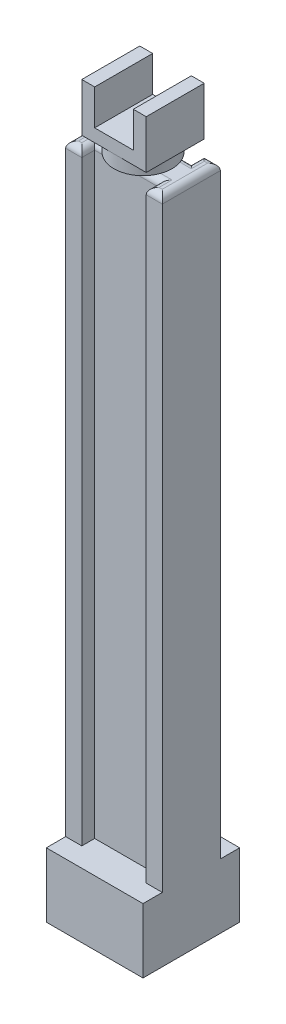
ISO-10303-21;
HEADER;
FILE_DESCRIPTION(('STEP AP214'),'2;1');
FILE_NAME('part.step','',(''),(''),'','','');
FILE_SCHEMA(('AUTOMOTIVE_DESIGN { 1 0 10303 214 1 1 1 1 }'));
ENDSEC;
DATA;
#1=APPLICATION_CONTEXT('core data for automotive mechanical design processes');
#2=APPLICATION_PROTOCOL_DEFINITION('international standard','automotive_design',2000,#1);
#3=PRODUCT_CONTEXT('',#1,'mechanical');
#4=PRODUCT('Part','Part','',(#3));
#5=PRODUCT_RELATED_PRODUCT_CATEGORY('part','',(#4));
#6=PRODUCT_DEFINITION_FORMATION('','',#4);
#7=PRODUCT_DEFINITION_CONTEXT('part definition',#1,'design');
#8=PRODUCT_DEFINITION('design','',#6,#7);
#9=PRODUCT_DEFINITION_SHAPE('','',#8);
#10=(LENGTH_UNIT() NAMED_UNIT(*) SI_UNIT(.MILLI.,.METRE.));
#11=(NAMED_UNIT(*) PLANE_ANGLE_UNIT() SI_UNIT($,.RADIAN.));
#12=(NAMED_UNIT(*) SI_UNIT($,.STERADIAN.) SOLID_ANGLE_UNIT());
#13=UNCERTAINTY_MEASURE_WITH_UNIT(LENGTH_MEASURE(1.E-05),#10,'distance_accuracy_value','');
#14=(GEOMETRIC_REPRESENTATION_CONTEXT(3) GLOBAL_UNCERTAINTY_ASSIGNED_CONTEXT((#13)) GLOBAL_UNIT_ASSIGNED_CONTEXT((#10,
#11,#12)) REPRESENTATION_CONTEXT('',''));
#15=CARTESIAN_POINT('',(0.,0.,0.));
#16=DIRECTION('',(0.,0.,1.));
#17=DIRECTION('',(1.,0.,0.));
#18=AXIS2_PLACEMENT_3D('',#15,#16,#17);
#19=CARTESIAN_POINT('',(-50.,1130.,45.));
#20=DIRECTION('',(0.,-1.,0.));
#21=DIRECTION('',(0.,0.,-1.));
#22=AXIS2_PLACEMENT_3D('',#19,#20,#21);
#23=PLANE('',#22);
#24=DIRECTION('',(-1.,0.,0.));
#25=VECTOR('',#24,1.);
#26=CARTESIAN_POINT('',(-50.,1130.,-45.));
#27=LINE('',#26,#25);
#28=CARTESIAN_POINT('',(50.,1130.,-45.));
#29=VERTEX_POINT('',#28);
#30=CARTESIAN_POINT('',(29.9999999999999,1130.,-45.));
#31=VERTEX_POINT('',#30);
#32=EDGE_CURVE('E295',#29,#31,#27,.T.);
#33=ORIENTED_EDGE('',*,*,#32,.T.);
#34=DIRECTION('',(0.,0.,1.));
#35=VECTOR('',#34,1.);
#36=CARTESIAN_POINT('',(29.9999999999999,1130.,45.));
#37=LINE('',#36,#35);
#38=CARTESIAN_POINT('',(29.9999999999999,1130.,45.));
#39=VERTEX_POINT('',#38);
#40=EDGE_CURVE('E274',#31,#39,#37,.T.);
#41=ORIENTED_EDGE('',*,*,#40,.T.);
#42=DIRECTION('',(-1.,0.,0.));
#43=VECTOR('',#42,1.);
#44=CARTESIAN_POINT('',(-50.,1130.,45.));
#45=LINE('',#44,#43);
#46=CARTESIAN_POINT('',(50.,1130.,45.));
#47=VERTEX_POINT('',#46);
#48=EDGE_CURVE('E283',#47,#39,#45,.T.);
#49=ORIENTED_EDGE('',*,*,#48,.F.);
#50=DIRECTION('',(0.,0.,-1.));
#51=VECTOR('',#50,1.);
#52=CARTESIAN_POINT('',(50.,1130.,45.));
#53=LINE('',#52,#51);
#54=EDGE_CURVE('E311',#47,#29,#53,.T.);
#55=ORIENTED_EDGE('',*,*,#54,.T.);
#56=EDGE_LOOP('',(#33,#41,#49,#55));
#57=FACE_BOUND('',#56,.T.);
#58=ADVANCED_FACE('F33',(#57),#23,.F.);
#59=CARTESIAN_POINT('',(75.,1035.,75.));
#60=DIRECTION('',(0.,1.,0.));
#61=DIRECTION('',(0.,0.,1.));
#62=AXIS2_PLACEMENT_3D('',#59,#60,#61);
#63=PLANE('',#62);
#64=DIRECTION('',(-1.,0.,0.));
#65=VECTOR('',#64,1.);
#66=CARTESIAN_POINT('',(50.,1035.,15.));
#67=LINE('',#66,#65);
#68=CARTESIAN_POINT('',(-60.,1035.,15.));
#69=VERTEX_POINT('',#68);
#70=CARTESIAN_POINT('',(-42.4264068711928,1035.,15.));
#71=VERTEX_POINT('',#70);
#72=EDGE_CURVE('E445',#69,#71,#67,.F.);
#73=ORIENTED_EDGE('',*,*,#72,.T.);
#74=CARTESIAN_POINT('',(0.,1035.,0.));
#75=DIRECTION('',(0.,1.,0.));
#76=DIRECTION('',(0.,0.,1.));
#77=AXIS2_PLACEMENT_3D('',#74,#75,#76);
#78=CIRCLE('',#77,45.);
#79=CARTESIAN_POINT('',(-42.4264068711929,1035.,-15.));
#80=VERTEX_POINT('',#79);
#81=EDGE_CURVE('E519',#80,#71,#78,.T.);
#82=ORIENTED_EDGE('',*,*,#81,.F.);
#83=DIRECTION('',(1.,0.,0.));
#84=VECTOR('',#83,1.);
#85=CARTESIAN_POINT('',(-50.,1035.,-15.));
#86=LINE('',#85,#84);
#87=CARTESIAN_POINT('',(-60.,1035.,-15.));
#88=VERTEX_POINT('',#87);
#89=EDGE_CURVE('E430',#80,#88,#86,.F.);
#90=ORIENTED_EDGE('',*,*,#89,.T.);
#91=DIRECTION('',(0.,0.,1.));
#92=VECTOR('',#91,1.);
#93=CARTESIAN_POINT('',(-60.,1035.,-45.));
#94=LINE('',#93,#92);
#95=CARTESIAN_POINT('',(-60.,1035.,-35.));
#96=VERTEX_POINT('',#95);
#97=EDGE_CURVE('E434',#88,#96,#94,.F.);
#98=ORIENTED_EDGE('',*,*,#97,.T.);
#99=DIRECTION('',(1.,0.,0.));
#100=VECTOR('',#99,1.);
#101=CARTESIAN_POINT('',(-75.,1035.,-35.));
#102=LINE('',#101,#100);
#103=CARTESIAN_POINT('',(-65.,1035.,-35.));
#104=VERTEX_POINT('',#103);
#105=EDGE_CURVE('E436',#96,#104,#102,.F.);
#106=ORIENTED_EDGE('',*,*,#105,.T.);
#107=DIRECTION('',(0.,0.,1.));
#108=VECTOR('',#107,1.);
#109=CARTESIAN_POINT('',(-65.,1035.,45.));
#110=LINE('',#109,#108);
#111=CARTESIAN_POINT('',(-65.,1035.,35.));
#112=VERTEX_POINT('',#111);
#113=EDGE_CURVE('E438',#104,#112,#110,.T.);
#114=ORIENTED_EDGE('',*,*,#113,.T.);
#115=DIRECTION('',(-1.,0.,0.));
#116=VECTOR('',#115,1.);
#117=CARTESIAN_POINT('',(-50.,1035.,35.));
#118=LINE('',#117,#116);
#119=CARTESIAN_POINT('',(-60.,1035.,35.));
#120=VERTEX_POINT('',#119);
#121=EDGE_CURVE('E440',#112,#120,#118,.F.);
#122=ORIENTED_EDGE('',*,*,#121,.T.);
#123=DIRECTION('',(0.,0.,1.));
#124=VECTOR('',#123,1.);
#125=CARTESIAN_POINT('',(-60.,1035.,25.));
#126=LINE('',#125,#124);
#127=EDGE_CURVE('E442',#120,#69,#126,.F.);
#128=ORIENTED_EDGE('',*,*,#127,.T.);
#129=EDGE_LOOP('',(#73,#82,#90,#98,#106,#114,#122,#128));
#130=FACE_BOUND('',#129,.T.);
#131=ADVANCED_FACE('F516',(#130),#63,.T.);
#132=CARTESIAN_POINT('',(60.,1035.,-15.));
#133=VERTEX_POINT('',#132);
#134=CARTESIAN_POINT('',(42.4264068711929,1035.,-15.));
#135=VERTEX_POINT('',#134);
#136=EDGE_CURVE('E431',#133,#135,#86,.F.);
#137=ORIENTED_EDGE('',*,*,#136,.T.);
#138=CARTESIAN_POINT('',(42.4264068711929,1035.,15.));
#139=VERTEX_POINT('',#138);
#140=EDGE_CURVE('E318',#139,#135,#78,.T.);
#141=ORIENTED_EDGE('',*,*,#140,.F.);
#142=CARTESIAN_POINT('',(60.,1035.,15.));
#143=VERTEX_POINT('',#142);
#144=EDGE_CURVE('E444',#139,#143,#67,.F.);
#145=ORIENTED_EDGE('',*,*,#144,.T.);
#146=DIRECTION('',(0.,0.,-1.));
#147=VECTOR('',#146,1.);
#148=CARTESIAN_POINT('',(60.,1035.,45.));
#149=LINE('',#148,#147);
#150=CARTESIAN_POINT('',(60.,1035.,35.));
#151=VERTEX_POINT('',#150);
#152=EDGE_CURVE('E448',#143,#151,#149,.F.);
#153=ORIENTED_EDGE('',*,*,#152,.T.);
#154=DIRECTION('',(-1.,0.,0.));
#155=VECTOR('',#154,1.);
#156=CARTESIAN_POINT('',(75.,1035.,35.));
#157=LINE('',#156,#155);
#158=CARTESIAN_POINT('',(65.,1035.,35.));
#159=VERTEX_POINT('',#158);
#160=EDGE_CURVE('E422',#151,#159,#157,.F.);
#161=ORIENTED_EDGE('',*,*,#160,.T.);
#162=DIRECTION('',(0.,0.,-1.));
#163=VECTOR('',#162,1.);
#164=CARTESIAN_POINT('',(65.,1035.,-45.));
#165=LINE('',#164,#163);
#166=CARTESIAN_POINT('',(65.,1035.,-35.));
#167=VERTEX_POINT('',#166);
#168=EDGE_CURVE('E424',#159,#167,#165,.T.);
#169=ORIENTED_EDGE('',*,*,#168,.T.);
#170=DIRECTION('',(1.,0.,0.));
#171=VECTOR('',#170,1.);
#172=CARTESIAN_POINT('',(50.,1035.,-35.));
#173=LINE('',#172,#171);
#174=CARTESIAN_POINT('',(60.,1035.,-35.));
#175=VERTEX_POINT('',#174);
#176=EDGE_CURVE('E426',#167,#175,#173,.F.);
#177=ORIENTED_EDGE('',*,*,#176,.T.);
#178=DIRECTION('',(0.,0.,-1.));
#179=VECTOR('',#178,1.);
#180=CARTESIAN_POINT('',(60.,1035.,-25.));
#181=LINE('',#180,#179);
#182=EDGE_CURVE('E428',#175,#133,#181,.F.);
#183=ORIENTED_EDGE('',*,*,#182,.T.);
#184=EDGE_LOOP('',(#137,#141,#145,#153,#161,#169,#177,#183));
#185=FACE_BOUND('',#184,.T.);
#186=ADVANCED_FACE('F533',(#185),#63,.T.);
#187=CARTESIAN_POINT('',(75.,1035.,-75.));
#188=DIRECTION('',(-1.,0.,0.));
#189=DIRECTION('',(0.,0.,1.));
#190=AXIS2_PLACEMENT_3D('',#187,#188,#189);
#191=PLANE('',#190);
#192=DIRECTION('',(0.,1.,0.));
#193=VECTOR('',#192,1.);
#194=CARTESIAN_POINT('',(75.,-52.9705854077835,-45.));
#195=LINE('',#194,#193);
#196=CARTESIAN_POINT('',(75.,99.9999999999999,-45.));
#197=VERTEX_POINT('',#196);
#198=CARTESIAN_POINT('',(75.,1025.,-45.));
#199=VERTEX_POINT('',#198);
#200=EDGE_CURVE('E351',#197,#199,#195,.T.);
#201=ORIENTED_EDGE('',*,*,#200,.T.);
#202=DIRECTION('',(0.,0.,-1.));
#203=VECTOR('',#202,1.);
#204=CARTESIAN_POINT('',(75.,1025.,45.));
#205=LINE('',#204,#203);
#206=CARTESIAN_POINT('',(75.,1025.,45.));
#207=VERTEX_POINT('',#206);
#208=EDGE_CURVE('E470',#199,#207,#205,.F.);
#209=ORIENTED_EDGE('',*,*,#208,.T.);
#210=DIRECTION('',(0.,1.,0.));
#211=VECTOR('',#210,1.);
#212=CARTESIAN_POINT('',(75.,-52.9705854077835,45.));
#213=LINE('',#212,#211);
#214=CARTESIAN_POINT('',(75.,99.9999999999999,45.));
#215=VERTEX_POINT('',#214);
#216=EDGE_CURVE('E336',#215,#207,#213,.T.);
#217=ORIENTED_EDGE('',*,*,#216,.F.);
#218=DIRECTION('',(0.,0.,-1.));
#219=VECTOR('',#218,1.);
#220=CARTESIAN_POINT('',(75.,99.9999999999999,45.));
#221=LINE('',#220,#219);
#222=CARTESIAN_POINT('',(75.,99.9999999999999,75.));
#223=VERTEX_POINT('',#222);
#224=EDGE_CURVE('E333',#223,#215,#221,.T.);
#225=ORIENTED_EDGE('',*,*,#224,.F.);
#226=DIRECTION('',(0.,-1.,0.));
#227=VECTOR('',#226,1.);
#228=CARTESIAN_POINT('',(75.,1035.,75.));
#229=LINE('',#228,#227);
#230=CARTESIAN_POINT('',(75.,0.,75.));
#231=VERTEX_POINT('',#230);
#232=EDGE_CURVE('E411',#223,#231,#229,.T.);
#233=ORIENTED_EDGE('',*,*,#232,.T.);
#234=DIRECTION('',(0.,0.,-1.));
#235=VECTOR('',#234,1.);
#236=CARTESIAN_POINT('',(75.,0.,-75.));
#237=LINE('',#236,#235);
#238=CARTESIAN_POINT('',(75.,0.,-75.));
#239=VERTEX_POINT('',#238);
#240=EDGE_CURVE('E397',#231,#239,#237,.T.);
#241=ORIENTED_EDGE('',*,*,#240,.T.);
#242=DIRECTION('',(0.,-1.,0.));
#243=VECTOR('',#242,1.);
#244=CARTESIAN_POINT('',(75.,1035.,-75.));
#245=LINE('',#244,#243);
#246=CARTESIAN_POINT('',(75.,99.9999999999999,-75.));
#247=VERTEX_POINT('',#246);
#248=EDGE_CURVE('E417',#247,#239,#245,.T.);
#249=ORIENTED_EDGE('',*,*,#248,.F.);
#250=DIRECTION('',(0.,0.,-1.));
#251=VECTOR('',#250,1.);
#252=CARTESIAN_POINT('',(75.,99.9999999999999,-45.));
#253=LINE('',#252,#251);
#254=EDGE_CURVE('E347',#197,#247,#253,.T.);
#255=ORIENTED_EDGE('',*,*,#254,.F.);
#256=EDGE_LOOP('',(#201,#209,#217,#225,#233,#241,#249,#255));
#257=FACE_BOUND('',#256,.T.);
#258=ADVANCED_FACE('F733',(#257),#191,.F.);
#259=CARTESIAN_POINT('',(-75.,1035.,-75.));
#260=DIRECTION('',(0.,0.,1.));
#261=DIRECTION('',(1.,0.,0.));
#262=AXIS2_PLACEMENT_3D('',#259,#260,#261);
#263=PLANE('',#262);
#264=DIRECTION('',(0.,-1.,0.));
#265=VECTOR('',#264,1.);
#266=CARTESIAN_POINT('',(-75.,1035.,-75.));
#267=LINE('',#266,#265);
#268=CARTESIAN_POINT('',(-75.,99.9999999999999,-75.));
#269=VERTEX_POINT('',#268);
#270=CARTESIAN_POINT('',(-75.,0.,-75.));
#271=VERTEX_POINT('',#270);
#272=EDGE_CURVE('E415',#269,#271,#267,.T.);
#273=ORIENTED_EDGE('',*,*,#272,.F.);
#274=DIRECTION('',(-1.,0.,0.));
#275=VECTOR('',#274,1.);
#276=CARTESIAN_POINT('',(50.,99.9999999999999,-75.));
#277=LINE('',#276,#275);
#278=EDGE_CURVE('E391',#247,#269,#277,.T.);
#279=ORIENTED_EDGE('',*,*,#278,.F.);
#280=ORIENTED_EDGE('',*,*,#248,.T.);
#281=DIRECTION('',(-1.,0.,0.));
#282=VECTOR('',#281,1.);
#283=CARTESIAN_POINT('',(-75.,0.,-75.));
#284=LINE('',#283,#282);
#285=EDGE_CURVE('E402',#239,#271,#284,.T.);
#286=ORIENTED_EDGE('',*,*,#285,.T.);
#287=EDGE_LOOP('',(#273,#279,#280,#286));
#288=FACE_BOUND('',#287,.T.);
#289=ADVANCED_FACE('F900',(#288),#263,.F.);
#290=CARTESIAN_POINT('',(-75.,1035.,-75.));
#291=DIRECTION('',(1.,0.,0.));
#292=DIRECTION('',(0.,0.,-1.));
#293=AXIS2_PLACEMENT_3D('',#290,#291,#292);
#294=PLANE('',#293);
#295=DIRECTION('',(0.,1.,0.));
#296=VECTOR('',#295,1.);
#297=CARTESIAN_POINT('',(-75.,-52.9705854077835,45.));
#298=LINE('',#297,#296);
#299=CARTESIAN_POINT('',(-75.,99.9999999999999,45.));
#300=VERTEX_POINT('',#299);
#301=CARTESIAN_POINT('',(-75.,1025.,45.));
#302=VERTEX_POINT('',#301);
#303=EDGE_CURVE('E328',#300,#302,#298,.T.);
#304=ORIENTED_EDGE('',*,*,#303,.T.);
#305=DIRECTION('',(0.,0.,1.));
#306=VECTOR('',#305,1.);
#307=CARTESIAN_POINT('',(-75.,1025.,-45.));
#308=LINE('',#307,#306);
#309=CARTESIAN_POINT('',(-75.,1025.,-45.));
#310=VERTEX_POINT('',#309);
#311=EDGE_CURVE('E458',#302,#310,#308,.F.);
#312=ORIENTED_EDGE('',*,*,#311,.T.);
#313=DIRECTION('',(0.,1.,0.));
#314=VECTOR('',#313,1.);
#315=CARTESIAN_POINT('',(-75.,-52.9705854077835,-45.));
#316=LINE('',#315,#314);
#317=CARTESIAN_POINT('',(-75.,99.9999999999999,-45.));
#318=VERTEX_POINT('',#317);
#319=EDGE_CURVE('E358',#318,#310,#316,.T.);
#320=ORIENTED_EDGE('',*,*,#319,.F.);
#321=DIRECTION('',(0.,0.,1.));
#322=VECTOR('',#321,1.);
#323=CARTESIAN_POINT('',(-75.,99.9999999999999,-45.));
#324=LINE('',#323,#322);
#325=EDGE_CURVE('E346',#269,#318,#324,.T.);
#326=ORIENTED_EDGE('',*,*,#325,.F.);
#327=ORIENTED_EDGE('',*,*,#272,.T.);
#328=DIRECTION('',(0.,0.,1.));
#329=VECTOR('',#328,1.);
#330=CARTESIAN_POINT('',(-75.,0.,-75.));
#331=LINE('',#330,#329);
#332=CARTESIAN_POINT('',(-75.,0.,75.));
#333=VERTEX_POINT('',#332);
#334=EDGE_CURVE('E405',#271,#333,#331,.T.);
#335=ORIENTED_EDGE('',*,*,#334,.T.);
#336=DIRECTION('',(0.,-1.,0.));
#337=VECTOR('',#336,1.);
#338=CARTESIAN_POINT('',(-75.,1035.,75.));
#339=LINE('',#338,#337);
#340=CARTESIAN_POINT('',(-75.,99.9999999999999,75.));
#341=VERTEX_POINT('',#340);
#342=EDGE_CURVE('E413',#341,#333,#339,.T.);
#343=ORIENTED_EDGE('',*,*,#342,.F.);
#344=DIRECTION('',(0.,0.,1.));
#345=VECTOR('',#344,1.);
#346=CARTESIAN_POINT('',(-75.,99.9999999999999,45.));
#347=LINE('',#346,#345);
#348=EDGE_CURVE('E324',#300,#341,#347,.T.);
#349=ORIENTED_EDGE('',*,*,#348,.F.);
#350=EDGE_LOOP('',(#304,#312,#320,#326,#327,#335,#343,#349));
#351=FACE_BOUND('',#350,.T.);
#352=ADVANCED_FACE('F890',(#351),#294,.F.);
#353=CARTESIAN_POINT('',(-75.,1035.,75.));
#354=DIRECTION('',(0.,0.,-1.));
#355=DIRECTION('',(-1.,0.,0.));
#356=AXIS2_PLACEMENT_3D('',#353,#354,#355);
#357=PLANE('',#356);
#358=ORIENTED_EDGE('',*,*,#232,.F.);
#359=DIRECTION('',(1.,0.,0.));
#360=VECTOR('',#359,1.);
#361=CARTESIAN_POINT('',(50.,99.9999999999999,75.));
#362=LINE('',#361,#360);
#363=EDGE_CURVE('E375',#341,#223,#362,.T.);
#364=ORIENTED_EDGE('',*,*,#363,.F.);
#365=ORIENTED_EDGE('',*,*,#342,.T.);
#366=DIRECTION('',(1.,0.,0.));
#367=VECTOR('',#366,1.);
#368=CARTESIAN_POINT('',(-75.,0.,75.));
#369=LINE('',#368,#367);
#370=EDGE_CURVE('E408',#333,#231,#369,.T.);
#371=ORIENTED_EDGE('',*,*,#370,.T.);
#372=EDGE_LOOP('',(#358,#364,#365,#371));
#373=FACE_BOUND('',#372,.T.);
#374=ADVANCED_FACE('F884',(#373),#357,.F.);
#375=CARTESIAN_POINT('',(75.,0.,75.));
#376=DIRECTION('',(0.,1.,0.));
#377=DIRECTION('',(0.,0.,1.));
#378=AXIS2_PLACEMENT_3D('',#375,#376,#377);
#379=PLANE('',#378);
#380=ORIENTED_EDGE('',*,*,#240,.F.);
#381=ORIENTED_EDGE('',*,*,#370,.F.);
#382=ORIENTED_EDGE('',*,*,#334,.F.);
#383=ORIENTED_EDGE('',*,*,#285,.F.);
#384=EDGE_LOOP('',(#380,#381,#382,#383));
#385=FACE_BOUND('',#384,.T.);
#386=ADVANCED_FACE('F889',(#385),#379,.F.);
#387=CARTESIAN_POINT('',(-50.,99.9999999999999,-25.));
#388=DIRECTION('',(-1.,0.,0.));
#389=DIRECTION('',(0.,0.,1.));
#390=AXIS2_PLACEMENT_3D('',#387,#388,#389);
#391=PLANE('',#390);
#392=DIRECTION('',(0.,1.,0.));
#393=VECTOR('',#392,1.);
#394=CARTESIAN_POINT('',(-50.,99.9999999999999,-45.));
#395=LINE('',#394,#393);
#396=CARTESIAN_POINT('',(-50.,99.9999999999999,-45.));
#397=VERTEX_POINT('',#396);
#398=CARTESIAN_POINT('',(-50.,1025.,-45.));
#399=VERTEX_POINT('',#398);
#400=EDGE_CURVE('E364',#397,#399,#395,.T.);
#401=ORIENTED_EDGE('',*,*,#400,.T.);
#402=DIRECTION('',(0.,0.,1.));
#403=VECTOR('',#402,1.);
#404=CARTESIAN_POINT('',(-50.,1025.,-25.));
#405=LINE('',#404,#403);
#406=CARTESIAN_POINT('',(-50.,1025.,-25.));
#407=VERTEX_POINT('',#406);
#408=EDGE_CURVE('E462',#399,#407,#405,.T.);
#409=ORIENTED_EDGE('',*,*,#408,.T.);
#410=DIRECTION('',(0.,1.,0.));
#411=VECTOR('',#410,1.);
#412=CARTESIAN_POINT('',(-50.,99.9999999999999,-25.));
#413=LINE('',#412,#411);
#414=CARTESIAN_POINT('',(-50.,99.9999999999999,-25.));
#415=VERTEX_POINT('',#414);
#416=EDGE_CURVE('E393',#415,#407,#413,.T.);
#417=ORIENTED_EDGE('',*,*,#416,.F.);
#418=DIRECTION('',(0.,0.,1.));
#419=VECTOR('',#418,1.);
#420=CARTESIAN_POINT('',(-50.,99.9999999999999,-25.));
#421=LINE('',#420,#419);
#422=EDGE_CURVE('E381',#397,#415,#421,.T.);
#423=ORIENTED_EDGE('',*,*,#422,.F.);
#424=EDGE_LOOP('',(#401,#409,#417,#423));
#425=FACE_BOUND('',#424,.T.);
#426=ADVANCED_FACE('F913',(#425),#391,.F.);
#427=CARTESIAN_POINT('',(50.,99.9999999999999,-25.));
#428=DIRECTION('',(1.,0.,0.));
#429=DIRECTION('',(0.,0.,-1.));
#430=AXIS2_PLACEMENT_3D('',#427,#428,#429);
#431=PLANE('',#430);
#432=DIRECTION('',(0.,1.,0.));
#433=VECTOR('',#432,1.);
#434=CARTESIAN_POINT('',(50.,99.9999999999999,-25.));
#435=LINE('',#434,#433);
#436=CARTESIAN_POINT('',(50.,99.9999999999999,-25.));
#437=VERTEX_POINT('',#436);
#438=CARTESIAN_POINT('',(50.,1025.,-25.));
#439=VERTEX_POINT('',#438);
#440=EDGE_CURVE('E394',#437,#439,#435,.T.);
#441=ORIENTED_EDGE('',*,*,#440,.T.);
#442=DIRECTION('',(0.,0.,-1.));
#443=VECTOR('',#442,1.);
#444=CARTESIAN_POINT('',(50.,1025.,-45.));
#445=LINE('',#444,#443);
#446=CARTESIAN_POINT('',(50.,1025.,-45.));
#447=VERTEX_POINT('',#446);
#448=EDGE_CURVE('E466',#439,#447,#445,.T.);
#449=ORIENTED_EDGE('',*,*,#448,.T.);
#450=DIRECTION('',(0.,-1.,0.));
#451=VECTOR('',#450,1.);
#452=CARTESIAN_POINT('',(50.,99.9999999999999,-45.));
#453=LINE('',#452,#451);
#454=CARTESIAN_POINT('',(50.,99.9999999999999,-45.));
#455=VERTEX_POINT('',#454);
#456=EDGE_CURVE('E350',#447,#455,#453,.T.);
#457=ORIENTED_EDGE('',*,*,#456,.T.);
#458=DIRECTION('',(0.,0.,-1.));
#459=VECTOR('',#458,1.);
#460=CARTESIAN_POINT('',(50.,99.9999999999999,-25.));
#461=LINE('',#460,#459);
#462=EDGE_CURVE('E388',#437,#455,#461,.T.);
#463=ORIENTED_EDGE('',*,*,#462,.F.);
#464=EDGE_LOOP('',(#441,#449,#457,#463));
#465=FACE_BOUND('',#464,.T.);
#466=ADVANCED_FACE('F924',(#465),#431,.F.);
#467=CARTESIAN_POINT('',(50.,99.9999999999999,-25.));
#468=DIRECTION('',(0.,0.,1.));
#469=DIRECTION('',(1.,0.,0.));
#470=AXIS2_PLACEMENT_3D('',#467,#468,#469);
#471=PLANE('',#470);
#472=ORIENTED_EDGE('',*,*,#416,.T.);
#473=DIRECTION('',(1.,0.,0.));
#474=VECTOR('',#473,1.);
#475=CARTESIAN_POINT('',(50.,1025.,-25.));
#476=LINE('',#475,#474);
#477=EDGE_CURVE('E464',#407,#439,#476,.T.);
#478=ORIENTED_EDGE('',*,*,#477,.T.);
#479=ORIENTED_EDGE('',*,*,#440,.F.);
#480=DIRECTION('',(1.,0.,0.));
#481=VECTOR('',#480,1.);
#482=CARTESIAN_POINT('',(50.,99.9999999999999,-25.));
#483=LINE('',#482,#481);
#484=EDGE_CURVE('E385',#415,#437,#483,.T.);
#485=ORIENTED_EDGE('',*,*,#484,.F.);
#486=EDGE_LOOP('',(#472,#478,#479,#485));
#487=FACE_BOUND('',#486,.T.);
#488=ADVANCED_FACE('F872',(#487),#471,.F.);
#489=CARTESIAN_POINT('',(-50.,99.9999999999999,-75.));
#490=DIRECTION('',(0.,1.,0.));
#491=DIRECTION('',(0.,0.,1.));
#492=AXIS2_PLACEMENT_3D('',#489,#490,#491);
#493=PLANE('',#492);
#494=ORIENTED_EDGE('',*,*,#462,.T.);
#495=DIRECTION('',(1.,0.,0.));
#496=VECTOR('',#495,1.);
#497=CARTESIAN_POINT('',(-75.,99.9999999999999,-45.));
#498=LINE('',#497,#496);
#499=EDGE_CURVE('E355',#455,#197,#498,.T.);
#500=ORIENTED_EDGE('',*,*,#499,.T.);
#501=ORIENTED_EDGE('',*,*,#254,.T.);
#502=ORIENTED_EDGE('',*,*,#278,.T.);
#503=ORIENTED_EDGE('',*,*,#325,.T.);
#504=EDGE_CURVE('E352',#318,#397,#498,.T.);
#505=ORIENTED_EDGE('',*,*,#504,.T.);
#506=ORIENTED_EDGE('',*,*,#422,.T.);
#507=ORIENTED_EDGE('',*,*,#484,.T.);
#508=EDGE_LOOP('',(#494,#500,#501,#502,#503,#505,#506,#507));
#509=FACE_BOUND('',#508,.T.);
#510=ADVANCED_FACE('F867',(#509),#493,.T.);
#511=CARTESIAN_POINT('',(50.,99.9999999999999,25.));
#512=DIRECTION('',(1.,0.,0.));
#513=DIRECTION('',(0.,0.,-1.));
#514=AXIS2_PLACEMENT_3D('',#511,#512,#513);
#515=PLANE('',#514);
#516=DIRECTION('',(0.,1.,0.));
#517=VECTOR('',#516,1.);
#518=CARTESIAN_POINT('',(50.,99.9999999999999,45.));
#519=LINE('',#518,#517);
#520=CARTESIAN_POINT('',(50.,99.9999999999999,45.));
#521=VERTEX_POINT('',#520);
#522=CARTESIAN_POINT('',(50.,1025.,45.));
#523=VERTEX_POINT('',#522);
#524=EDGE_CURVE('E343',#521,#523,#519,.T.);
#525=ORIENTED_EDGE('',*,*,#524,.T.);
#526=DIRECTION('',(0.,0.,-1.));
#527=VECTOR('',#526,1.);
#528=CARTESIAN_POINT('',(50.,1025.,25.));
#529=LINE('',#528,#527);
#530=CARTESIAN_POINT('',(50.,1025.,25.));
#531=VERTEX_POINT('',#530);
#532=EDGE_CURVE('E419',#523,#531,#529,.T.);
#533=ORIENTED_EDGE('',*,*,#532,.T.);
#534=DIRECTION('',(0.,1.,0.));
#535=VECTOR('',#534,1.);
#536=CARTESIAN_POINT('',(50.,99.9999999999999,25.));
#537=LINE('',#536,#535);
#538=CARTESIAN_POINT('',(50.,99.9999999999999,25.));
#539=VERTEX_POINT('',#538);
#540=EDGE_CURVE('E377',#539,#531,#537,.T.);
#541=ORIENTED_EDGE('',*,*,#540,.F.);
#542=DIRECTION('',(0.,0.,-1.));
#543=VECTOR('',#542,1.);
#544=CARTESIAN_POINT('',(50.,99.9999999999999,25.));
#545=LINE('',#544,#543);
#546=EDGE_CURVE('E367',#521,#539,#545,.T.);
#547=ORIENTED_EDGE('',*,*,#546,.F.);
#548=EDGE_LOOP('',(#525,#533,#541,#547));
#549=FACE_BOUND('',#548,.T.);
#550=ADVANCED_FACE('F546',(#549),#515,.F.);
#551=CARTESIAN_POINT('',(-50.,99.9999999999999,25.));
#552=DIRECTION('',(-1.,0.,0.));
#553=DIRECTION('',(0.,0.,1.));
#554=AXIS2_PLACEMENT_3D('',#551,#552,#553);
#555=PLANE('',#554);
#556=DIRECTION('',(0.,1.,0.));
#557=VECTOR('',#556,1.);
#558=CARTESIAN_POINT('',(-50.,99.9999999999999,25.));
#559=LINE('',#558,#557);
#560=CARTESIAN_POINT('',(-50.,99.9999999999999,25.));
#561=VERTEX_POINT('',#560);
#562=CARTESIAN_POINT('',(-50.,1025.,25.));
#563=VERTEX_POINT('',#562);
#564=EDGE_CURVE('E378',#561,#563,#559,.T.);
#565=ORIENTED_EDGE('',*,*,#564,.T.);
#566=DIRECTION('',(0.,0.,1.));
#567=VECTOR('',#566,1.);
#568=CARTESIAN_POINT('',(-50.,1025.,45.));
#569=LINE('',#568,#567);
#570=CARTESIAN_POINT('',(-50.,1025.,45.));
#571=VERTEX_POINT('',#570);
#572=EDGE_CURVE('E454',#563,#571,#569,.T.);
#573=ORIENTED_EDGE('',*,*,#572,.T.);
#574=DIRECTION('',(0.,-1.,0.));
#575=VECTOR('',#574,1.);
#576=CARTESIAN_POINT('',(-50.,99.9999999999999,45.));
#577=LINE('',#576,#575);
#578=CARTESIAN_POINT('',(-50.,99.9999999999999,45.));
#579=VERTEX_POINT('',#578);
#580=EDGE_CURVE('E327',#571,#579,#577,.T.);
#581=ORIENTED_EDGE('',*,*,#580,.T.);
#582=DIRECTION('',(0.,0.,1.));
#583=VECTOR('',#582,1.);
#584=CARTESIAN_POINT('',(-50.,99.9999999999999,25.));
#585=LINE('',#584,#583);
#586=EDGE_CURVE('E372',#561,#579,#585,.T.);
#587=ORIENTED_EDGE('',*,*,#586,.F.);
#588=EDGE_LOOP('',(#565,#573,#581,#587));
#589=FACE_BOUND('',#588,.T.);
#590=ADVANCED_FACE('F945',(#589),#555,.F.);
#591=CARTESIAN_POINT('',(50.,99.9999999999999,25.));
#592=DIRECTION('',(0.,0.,-1.));
#593=DIRECTION('',(-1.,0.,0.));
#594=AXIS2_PLACEMENT_3D('',#591,#592,#593);
#595=PLANE('',#594);
#596=ORIENTED_EDGE('',*,*,#540,.T.);
#597=DIRECTION('',(-1.,0.,0.));
#598=VECTOR('',#597,1.);
#599=CARTESIAN_POINT('',(-50.,1025.,25.));
#600=LINE('',#599,#598);
#601=EDGE_CURVE('E452',#531,#563,#600,.T.);
#602=ORIENTED_EDGE('',*,*,#601,.T.);
#603=ORIENTED_EDGE('',*,*,#564,.F.);
#604=DIRECTION('',(-1.,0.,0.));
#605=VECTOR('',#604,1.);
#606=CARTESIAN_POINT('',(50.,99.9999999999999,25.));
#607=LINE('',#606,#605);
#608=EDGE_CURVE('E369',#539,#561,#607,.T.);
#609=ORIENTED_EDGE('',*,*,#608,.F.);
#610=EDGE_LOOP('',(#596,#602,#603,#609));
#611=FACE_BOUND('',#610,.T.);
#612=ADVANCED_FACE('F549',(#611),#595,.F.);
#613=CARTESIAN_POINT('',(50.,99.9999999999999,75.));
#614=DIRECTION('',(0.,-1.,0.));
#615=DIRECTION('',(0.,0.,-1.));
#616=AXIS2_PLACEMENT_3D('',#613,#614,#615);
#617=PLANE('',#616);
#618=ORIENTED_EDGE('',*,*,#586,.T.);
#619=DIRECTION('',(-1.,0.,0.));
#620=VECTOR('',#619,1.);
#621=CARTESIAN_POINT('',(-75.,99.9999999999999,45.));
#622=LINE('',#621,#620);
#623=EDGE_CURVE('E332',#579,#300,#622,.T.);
#624=ORIENTED_EDGE('',*,*,#623,.T.);
#625=ORIENTED_EDGE('',*,*,#348,.T.);
#626=ORIENTED_EDGE('',*,*,#363,.T.);
#627=ORIENTED_EDGE('',*,*,#224,.T.);
#628=EDGE_CURVE('E329',#215,#521,#622,.T.);
#629=ORIENTED_EDGE('',*,*,#628,.T.);
#630=ORIENTED_EDGE('',*,*,#546,.T.);
#631=ORIENTED_EDGE('',*,*,#608,.T.);
#632=EDGE_LOOP('',(#618,#624,#625,#626,#627,#629,#630,#631));
#633=FACE_BOUND('',#632,.T.);
#634=ADVANCED_FACE('F552',(#633),#617,.F.);
#635=CARTESIAN_POINT('',(-75.,-52.9705854077835,-45.));
#636=DIRECTION('',(0.,0.,1.));
#637=DIRECTION('',(1.,0.,0.));
#638=AXIS2_PLACEMENT_3D('',#635,#636,#637);
#639=PLANE('',#638);
#640=ORIENTED_EDGE('',*,*,#456,.F.);
#641=DIRECTION('',(1.,0.,0.));
#642=VECTOR('',#641,1.);
#643=CARTESIAN_POINT('',(75.,1025.,-45.));
#644=LINE('',#643,#642);
#645=EDGE_CURVE('E468',#447,#199,#644,.T.);
#646=ORIENTED_EDGE('',*,*,#645,.T.);
#647=ORIENTED_EDGE('',*,*,#200,.F.);
#648=ORIENTED_EDGE('',*,*,#499,.F.);
#649=EDGE_LOOP('',(#640,#646,#647,#648));
#650=FACE_BOUND('',#649,.T.);
#651=ADVANCED_FACE('F842',(#650),#639,.F.);
#652=ORIENTED_EDGE('',*,*,#319,.T.);
#653=DIRECTION('',(1.,0.,0.));
#654=VECTOR('',#653,1.);
#655=CARTESIAN_POINT('',(-50.,1025.,-45.));
#656=LINE('',#655,#654);
#657=EDGE_CURVE('E460',#310,#399,#656,.T.);
#658=ORIENTED_EDGE('',*,*,#657,.T.);
#659=ORIENTED_EDGE('',*,*,#400,.F.);
#660=ORIENTED_EDGE('',*,*,#504,.F.);
#661=EDGE_LOOP('',(#652,#658,#659,#660));
#662=FACE_BOUND('',#661,.T.);
#663=ADVANCED_FACE('F834',(#662),#639,.F.);
#664=CARTESIAN_POINT('',(-75.,-52.9705854077835,45.));
#665=DIRECTION('',(0.,0.,-1.));
#666=DIRECTION('',(-1.,0.,0.));
#667=AXIS2_PLACEMENT_3D('',#664,#665,#666);
#668=PLANE('',#667);
#669=ORIENTED_EDGE('',*,*,#580,.F.);
#670=DIRECTION('',(-1.,0.,0.));
#671=VECTOR('',#670,1.);
#672=CARTESIAN_POINT('',(-75.,1025.,45.));
#673=LINE('',#672,#671);
#674=EDGE_CURVE('E456',#571,#302,#673,.T.);
#675=ORIENTED_EDGE('',*,*,#674,.T.);
#676=ORIENTED_EDGE('',*,*,#303,.F.);
#677=ORIENTED_EDGE('',*,*,#623,.F.);
#678=EDGE_LOOP('',(#669,#675,#676,#677));
#679=FACE_BOUND('',#678,.T.);
#680=ADVANCED_FACE('F826',(#679),#668,.F.);
#681=ORIENTED_EDGE('',*,*,#216,.T.);
#682=DIRECTION('',(-1.,0.,0.));
#683=VECTOR('',#682,1.);
#684=CARTESIAN_POINT('',(50.,1025.,45.));
#685=LINE('',#684,#683);
#686=EDGE_CURVE('E41',#207,#523,#685,.T.);
#687=ORIENTED_EDGE('',*,*,#686,.T.);
#688=ORIENTED_EDGE('',*,*,#524,.F.);
#689=ORIENTED_EDGE('',*,*,#628,.F.);
#690=EDGE_LOOP('',(#681,#687,#688,#689));
#691=FACE_BOUND('',#690,.T.);
#692=ADVANCED_FACE('F556',(#691),#668,.F.);
#693=CARTESIAN_POINT('',(-60.,1025.,-25.));
#694=DIRECTION('',(0.,0.,-1.));
#695=DIRECTION('',(-1.,0.,0.));
#696=AXIS2_PLACEMENT_3D('',#693,#694,#695);
#697=CYLINDRICAL_SURFACE('',#696,10.);
#698=CARTESIAN_POINT('',(-60.,1025.,-35.));
#699=DIRECTION('',(-0.707106781186548,0.,-0.707106781186547));
#700=DIRECTION('',(0.707106781186547,0.,-0.707106781186548));
#701=AXIS2_PLACEMENT_3D('',#698,#699,#700);
#702=ELLIPSE('',#701,14.1421356237309,10.);
#703=EDGE_CURVE('E500',#96,#399,#702,.T.);
#704=ORIENTED_EDGE('',*,*,#703,.F.);
#705=ORIENTED_EDGE('',*,*,#97,.F.);
#706=CARTESIAN_POINT('',(-60.,1025.,-15.));
#707=DIRECTION('',(-0.707106781186548,0.,-0.707106781186547));
#708=DIRECTION('',(0.707106781186547,0.,-0.707106781186548));
#709=AXIS2_PLACEMENT_3D('',#706,#707,#708);
#710=ELLIPSE('',#709,14.1421356237309,10.);
#711=EDGE_CURVE('E337',#407,#88,#710,.F.);
#712=ORIENTED_EDGE('',*,*,#711,.F.);
#713=ORIENTED_EDGE('',*,*,#408,.F.);
#714=EDGE_LOOP('',(#704,#705,#712,#713));
#715=FACE_BOUND('',#714,.T.);
#716=ADVANCED_FACE('F35',(#715),#697,.T.);
#717=CARTESIAN_POINT('',(50.,1025.,-15.));
#718=DIRECTION('',(-1.,0.,0.));
#719=DIRECTION('',(0.,0.,1.));
#720=AXIS2_PLACEMENT_3D('',#717,#718,#719);
#721=CYLINDRICAL_SURFACE('',#720,10.);
#722=ORIENTED_EDGE('',*,*,#711,.T.);
#723=ORIENTED_EDGE('',*,*,#89,.F.);
#724=DIRECTION('',(-1.,0.,0.));
#725=VECTOR('',#724,1.);
#726=CARTESIAN_POINT('',(50.,1035.,-15.));
#727=LINE('',#726,#725);
#728=EDGE_CURVE('E317',#80,#135,#727,.F.);
#729=ORIENTED_EDGE('',*,*,#728,.T.);
#730=ORIENTED_EDGE('',*,*,#136,.F.);
#731=CARTESIAN_POINT('',(60.,1025.,-15.));
#732=DIRECTION('',(-0.707106781186547,0.,0.707106781186548));
#733=DIRECTION('',(-0.707106781186548,0.,-0.707106781186547));
#734=AXIS2_PLACEMENT_3D('',#731,#732,#733);
#735=ELLIPSE('',#734,14.142135623731,10.);
#736=EDGE_CURVE('E497',#439,#133,#735,.F.);
#737=ORIENTED_EDGE('',*,*,#736,.F.);
#738=ORIENTED_EDGE('',*,*,#477,.F.);
#739=EDGE_LOOP('',(#722,#723,#729,#730,#737,#738));
#740=FACE_BOUND('',#739,.T.);
#741=ADVANCED_FACE('F507',(#740),#721,.T.);
#742=CARTESIAN_POINT('',(-75.,1025.,-35.));
#743=DIRECTION('',(-1.,0.,0.));
#744=DIRECTION('',(0.,0.,1.));
#745=AXIS2_PLACEMENT_3D('',#742,#743,#744);
#746=CYLINDRICAL_SURFACE('',#745,10.);
#747=ORIENTED_EDGE('',*,*,#703,.T.);
#748=ORIENTED_EDGE('',*,*,#657,.F.);
#749=CARTESIAN_POINT('',(-65.,1025.,-35.));
#750=DIRECTION('',(-0.707106781186547,0.,0.707106781186548));
#751=DIRECTION('',(-0.707106781186548,0.,-0.707106781186547));
#752=AXIS2_PLACEMENT_3D('',#749,#750,#751);
#753=ELLIPSE('',#752,14.1421356237309,10.);
#754=EDGE_CURVE('E494',#104,#310,#753,.T.);
#755=ORIENTED_EDGE('',*,*,#754,.F.);
#756=ORIENTED_EDGE('',*,*,#105,.F.);
#757=EDGE_LOOP('',(#747,#748,#755,#756));
#758=FACE_BOUND('',#757,.T.);
#759=ADVANCED_FACE('F799',(#758),#746,.T.);
#760=CARTESIAN_POINT('',(60.,1025.,-25.));
#761=DIRECTION('',(0.,0.,1.));
#762=DIRECTION('',(1.,0.,0.));
#763=AXIS2_PLACEMENT_3D('',#760,#761,#762);
#764=CYLINDRICAL_SURFACE('',#763,10.);
#765=ORIENTED_EDGE('',*,*,#736,.T.);
#766=ORIENTED_EDGE('',*,*,#182,.F.);
#767=CARTESIAN_POINT('',(60.,1025.,-35.));
#768=DIRECTION('',(-0.707106781186547,0.,0.707106781186548));
#769=DIRECTION('',(-0.707106781186548,0.,-0.707106781186547));
#770=AXIS2_PLACEMENT_3D('',#767,#768,#769);
#771=ELLIPSE('',#770,14.1421356237309,10.);
#772=EDGE_CURVE('E491',#447,#175,#771,.F.);
#773=ORIENTED_EDGE('',*,*,#772,.F.);
#774=ORIENTED_EDGE('',*,*,#448,.F.);
#775=EDGE_LOOP('',(#765,#766,#773,#774));
#776=FACE_BOUND('',#775,.T.);
#777=ADVANCED_FACE('F574',(#776),#764,.T.);
#778=CARTESIAN_POINT('',(-65.,1025.,75.));
#779=DIRECTION('',(0.,0.,-1.));
#780=DIRECTION('',(-1.,0.,0.));
#781=AXIS2_PLACEMENT_3D('',#778,#779,#780);
#782=CYLINDRICAL_SURFACE('',#781,10.);
#783=ORIENTED_EDGE('',*,*,#754,.T.);
#784=ORIENTED_EDGE('',*,*,#311,.F.);
#785=CARTESIAN_POINT('',(-65.,1025.,35.));
#786=DIRECTION('',(-0.707106781186547,0.,-0.707106781186547));
#787=DIRECTION('',(0.707106781186547,0.,-0.707106781186547));
#788=AXIS2_PLACEMENT_3D('',#785,#786,#787);
#789=ELLIPSE('',#788,14.1421356237309,10.);
#790=EDGE_CURVE('E488',#112,#302,#789,.F.);
#791=ORIENTED_EDGE('',*,*,#790,.F.);
#792=ORIENTED_EDGE('',*,*,#113,.F.);
#793=EDGE_LOOP('',(#783,#784,#791,#792));
#794=FACE_BOUND('',#793,.T.);
#795=ADVANCED_FACE('F783',(#794),#782,.T.);
#796=CARTESIAN_POINT('',(-75.,1025.,-35.));
#797=DIRECTION('',(-1.,0.,0.));
#798=DIRECTION('',(0.,0.,1.));
#799=AXIS2_PLACEMENT_3D('',#796,#797,#798);
#800=CYLINDRICAL_SURFACE('',#799,10.);
#801=ORIENTED_EDGE('',*,*,#772,.T.);
#802=ORIENTED_EDGE('',*,*,#176,.F.);
#803=CARTESIAN_POINT('',(65.,1025.,-35.));
#804=DIRECTION('',(0.707106781186548,0.,0.707106781186547));
#805=DIRECTION('',(-0.707106781186547,0.,0.707106781186548));
#806=AXIS2_PLACEMENT_3D('',#803,#804,#805);
#807=ELLIPSE('',#806,14.1421356237309,10.);
#808=EDGE_CURVE('E485',#199,#167,#807,.T.);
#809=ORIENTED_EDGE('',*,*,#808,.F.);
#810=ORIENTED_EDGE('',*,*,#645,.F.);
#811=EDGE_LOOP('',(#801,#802,#809,#810));
#812=FACE_BOUND('',#811,.T.);
#813=ADVANCED_FACE('F569',(#812),#800,.T.);
#814=CARTESIAN_POINT('',(-75.,1025.,35.));
#815=DIRECTION('',(1.,0.,0.));
#816=DIRECTION('',(0.,0.,-1.));
#817=AXIS2_PLACEMENT_3D('',#814,#815,#816);
#818=CYLINDRICAL_SURFACE('',#817,10.);
#819=ORIENTED_EDGE('',*,*,#790,.T.);
#820=ORIENTED_EDGE('',*,*,#674,.F.);
#821=CARTESIAN_POINT('',(-60.,1025.,35.));
#822=DIRECTION('',(0.707106781186548,0.,-0.707106781186547));
#823=DIRECTION('',(0.707106781186547,0.,0.707106781186548));
#824=AXIS2_PLACEMENT_3D('',#821,#822,#823);
#825=ELLIPSE('',#824,14.1421356237309,10.);
#826=EDGE_CURVE('E482',#120,#571,#825,.T.);
#827=ORIENTED_EDGE('',*,*,#826,.F.);
#828=ORIENTED_EDGE('',*,*,#121,.F.);
#829=EDGE_LOOP('',(#819,#820,#827,#828));
#830=FACE_BOUND('',#829,.T.);
#831=ADVANCED_FACE('F767',(#830),#818,.T.);
#832=CARTESIAN_POINT('',(65.,1025.,75.));
#833=DIRECTION('',(0.,0.,1.));
#834=DIRECTION('',(1.,0.,0.));
#835=AXIS2_PLACEMENT_3D('',#832,#833,#834);
#836=CYLINDRICAL_SURFACE('',#835,10.);
#837=ORIENTED_EDGE('',*,*,#808,.T.);
#838=ORIENTED_EDGE('',*,*,#168,.F.);
#839=CARTESIAN_POINT('',(65.,1025.,35.));
#840=DIRECTION('',(0.707106781186547,0.,-0.707106781186547));
#841=DIRECTION('',(0.707106781186548,0.,0.707106781186547));
#842=AXIS2_PLACEMENT_3D('',#839,#840,#841);
#843=ELLIPSE('',#842,14.142135623731,10.);
#844=EDGE_CURVE('E479',#207,#159,#843,.F.);
#845=ORIENTED_EDGE('',*,*,#844,.F.);
#846=ORIENTED_EDGE('',*,*,#208,.F.);
#847=EDGE_LOOP('',(#837,#838,#845,#846));
#848=FACE_BOUND('',#847,.T.);
#849=ADVANCED_FACE('F564',(#848),#836,.T.);
#850=CARTESIAN_POINT('',(-60.,1025.,25.));
#851=DIRECTION('',(0.,0.,-1.));
#852=DIRECTION('',(-1.,0.,0.));
#853=AXIS2_PLACEMENT_3D('',#850,#851,#852);
#854=CYLINDRICAL_SURFACE('',#853,10.);
#855=ORIENTED_EDGE('',*,*,#826,.T.);
#856=ORIENTED_EDGE('',*,*,#572,.F.);
#857=CARTESIAN_POINT('',(-60.,1025.,15.));
#858=DIRECTION('',(0.707106781186548,0.,-0.707106781186547));
#859=DIRECTION('',(0.707106781186547,0.,0.707106781186548));
#860=AXIS2_PLACEMENT_3D('',#857,#858,#859);
#861=ELLIPSE('',#860,14.1421356237309,10.);
#862=EDGE_CURVE('E476',#69,#563,#861,.T.);
#863=ORIENTED_EDGE('',*,*,#862,.F.);
#864=ORIENTED_EDGE('',*,*,#127,.F.);
#865=EDGE_LOOP('',(#855,#856,#863,#864));
#866=FACE_BOUND('',#865,.T.);
#867=ADVANCED_FACE('F751',(#866),#854,.T.);
#868=CARTESIAN_POINT('',(-75.,1025.,35.));
#869=DIRECTION('',(1.,0.,0.));
#870=DIRECTION('',(0.,0.,-1.));
#871=AXIS2_PLACEMENT_3D('',#868,#869,#870);
#872=CYLINDRICAL_SURFACE('',#871,10.);
#873=ORIENTED_EDGE('',*,*,#844,.T.);
#874=ORIENTED_EDGE('',*,*,#160,.F.);
#875=CARTESIAN_POINT('',(60.,1025.,35.));
#876=DIRECTION('',(0.707106781186547,0.,0.707106781186548));
#877=DIRECTION('',(0.707106781186548,0.,-0.707106781186547));
#878=AXIS2_PLACEMENT_3D('',#875,#876,#877);
#879=ELLIPSE('',#878,14.1421356237309,10.);
#880=EDGE_CURVE('E474',#523,#151,#879,.F.);
#881=ORIENTED_EDGE('',*,*,#880,.F.);
#882=ORIENTED_EDGE('',*,*,#686,.F.);
#883=EDGE_LOOP('',(#873,#874,#881,#882));
#884=FACE_BOUND('',#883,.T.);
#885=ADVANCED_FACE('F560',(#884),#872,.T.);
#886=CARTESIAN_POINT('',(50.,1025.,15.));
#887=DIRECTION('',(1.,0.,0.));
#888=DIRECTION('',(0.,0.,-1.));
#889=AXIS2_PLACEMENT_3D('',#886,#887,#888);
#890=CYLINDRICAL_SURFACE('',#889,10.);
#891=ORIENTED_EDGE('',*,*,#862,.T.);
#892=ORIENTED_EDGE('',*,*,#601,.F.);
#893=CARTESIAN_POINT('',(60.,1025.,15.));
#894=DIRECTION('',(0.707106781186547,0.,0.707106781186548));
#895=DIRECTION('',(-0.707106781186548,0.,0.707106781186547));
#896=AXIS2_PLACEMENT_3D('',#893,#894,#895);
#897=ELLIPSE('',#896,14.142135623731,10.);
#898=EDGE_CURVE('E323',#143,#531,#897,.T.);
#899=ORIENTED_EDGE('',*,*,#898,.F.);
#900=ORIENTED_EDGE('',*,*,#144,.F.);
#901=EDGE_CURVE('E449',#71,#139,#67,.F.);
#902=ORIENTED_EDGE('',*,*,#901,.F.);
#903=ORIENTED_EDGE('',*,*,#72,.F.);
#904=EDGE_LOOP('',(#891,#892,#899,#900,#902,#903));
#905=FACE_BOUND('',#904,.T.);
#906=ADVANCED_FACE('F541',(#905),#890,.T.);
#907=CARTESIAN_POINT('',(60.,1025.,25.));
#908=DIRECTION('',(0.,0.,1.));
#909=DIRECTION('',(1.,0.,0.));
#910=AXIS2_PLACEMENT_3D('',#907,#908,#909);
#911=CYLINDRICAL_SURFACE('',#910,10.);
#912=ORIENTED_EDGE('',*,*,#880,.T.);
#913=ORIENTED_EDGE('',*,*,#152,.F.);
#914=ORIENTED_EDGE('',*,*,#898,.T.);
#915=ORIENTED_EDGE('',*,*,#532,.F.);
#916=EDGE_LOOP('',(#912,#913,#914,#915));
#917=FACE_BOUND('',#916,.T.);
#918=ADVANCED_FACE('F536',(#917),#911,.T.);
#919=CARTESIAN_POINT('',(0.,1035.,0.));
#920=DIRECTION('',(0.,1.,0.));
#921=DIRECTION('',(0.,0.,1.));
#922=AXIS2_PLACEMENT_3D('',#919,#920,#921);
#923=PLANE('',#922);
#924=ORIENTED_EDGE('',*,*,#728,.F.);
#925=EDGE_CURVE('E321',#135,#80,#78,.T.);
#926=ORIENTED_EDGE('',*,*,#925,.F.);
#927=EDGE_LOOP('',(#924,#926));
#928=FACE_BOUND('',#927,.T.);
#929=ADVANCED_FACE('F578',(#928),#923,.F.);
#930=CARTESIAN_POINT('',(0.,1055.,0.));
#931=DIRECTION('',(0.,-1.,0.));
#932=DIRECTION('',(0.,0.,-1.));
#933=AXIS2_PLACEMENT_3D('',#930,#931,#932);
#934=CYLINDRICAL_SURFACE('',#933,45.);
#935=CARTESIAN_POINT('',(0.,1055.,0.));
#936=DIRECTION('',(0.,1.,0.));
#937=DIRECTION('',(0.,0.,1.));
#938=AXIS2_PLACEMENT_3D('',#935,#936,#937);
#939=CIRCLE('',#938,45.);
#940=CARTESIAN_POINT('',(0.,1055.,45.));
#941=VERTEX_POINT('',#940);
#942=CARTESIAN_POINT('',(0.,1055.,-45.));
#943=VERTEX_POINT('',#942);
#944=EDGE_CURVE('E315',#941,#943,#939,.T.);
#945=ORIENTED_EDGE('',*,*,#944,.F.);
#946=EDGE_CURVE('E55',#943,#941,#939,.T.);
#947=ORIENTED_EDGE('',*,*,#946,.F.);
#948=EDGE_LOOP('',(#945,#947));
#949=FACE_BOUND('',#948,.T.);
#950=ORIENTED_EDGE('',*,*,#140,.T.);
#951=ORIENTED_EDGE('',*,*,#925,.T.);
#952=ORIENTED_EDGE('',*,*,#81,.T.);
#953=EDGE_CURVE('E314',#71,#139,#78,.T.);
#954=ORIENTED_EDGE('',*,*,#953,.T.);
#955=EDGE_LOOP('',(#950,#951,#952,#954));
#956=FACE_BOUND('',#955,.T.);
#957=ADVANCED_FACE('F525',(#949,#956),#934,.T.);
#958=ORIENTED_EDGE('',*,*,#901,.T.);
#959=ORIENTED_EDGE('',*,*,#953,.F.);
#960=EDGE_LOOP('',(#958,#959));
#961=FACE_BOUND('',#960,.T.);
#962=ADVANCED_FACE('F529',(#961),#923,.F.);
#963=CARTESIAN_POINT('',(-50.,1055.,45.));
#964=DIRECTION('',(0.,1.,0.));
#965=DIRECTION('',(0.,0.,1.));
#966=AXIS2_PLACEMENT_3D('',#963,#964,#965);
#967=PLANE('',#966);
#968=DIRECTION('',(1.,0.,0.));
#969=VECTOR('',#968,1.);
#970=CARTESIAN_POINT('',(-50.,1055.,45.));
#971=LINE('',#970,#969);
#972=CARTESIAN_POINT('',(50.,1055.,45.));
#973=VERTEX_POINT('',#972);
#974=EDGE_CURVE('E287',#941,#973,#971,.T.);
#975=ORIENTED_EDGE('',*,*,#974,.F.);
#976=ORIENTED_EDGE('',*,*,#944,.T.);
#977=DIRECTION('',(1.,0.,0.));
#978=VECTOR('',#977,1.);
#979=CARTESIAN_POINT('',(-50.,1055.,-45.));
#980=LINE('',#979,#978);
#981=CARTESIAN_POINT('',(50.,1055.,-45.));
#982=VERTEX_POINT('',#981);
#983=EDGE_CURVE('E300',#943,#982,#980,.T.);
#984=ORIENTED_EDGE('',*,*,#983,.T.);
#985=DIRECTION('',(0.,0.,-1.));
#986=VECTOR('',#985,1.);
#987=CARTESIAN_POINT('',(50.,1055.,45.));
#988=LINE('',#987,#986);
#989=EDGE_CURVE('E291',#973,#982,#988,.T.);
#990=ORIENTED_EDGE('',*,*,#989,.F.);
#991=EDGE_LOOP('',(#975,#976,#984,#990));
#992=FACE_BOUND('',#991,.T.);
#993=ADVANCED_FACE('F589',(#992),#967,.F.);
#994=CARTESIAN_POINT('',(-50.,1055.,-45.));
#995=VERTEX_POINT('',#994);
#996=EDGE_CURVE('E282',#995,#943,#980,.T.);
#997=ORIENTED_EDGE('',*,*,#996,.T.);
#998=ORIENTED_EDGE('',*,*,#946,.T.);
#999=CARTESIAN_POINT('',(-50.,1055.,45.));
#1000=VERTEX_POINT('',#999);
#1001=EDGE_CURVE('E288',#1000,#941,#971,.T.);
#1002=ORIENTED_EDGE('',*,*,#1001,.F.);
#1003=DIRECTION('',(0.,0.,-1.));
#1004=VECTOR('',#1003,1.);
#1005=CARTESIAN_POINT('',(-50.,1055.,45.));
#1006=LINE('',#1005,#1004);
#1007=EDGE_CURVE('E305',#1000,#995,#1006,.T.);
#1008=ORIENTED_EDGE('',*,*,#1007,.T.);
#1009=EDGE_LOOP('',(#997,#998,#1002,#1008));
#1010=FACE_BOUND('',#1009,.T.);
#1011=ADVANCED_FACE('F608',(#1010),#967,.F.);
#1012=CARTESIAN_POINT('',(50.,1130.,45.));
#1013=DIRECTION('',(-1.,0.,0.));
#1014=DIRECTION('',(0.,-1.,0.));
#1015=AXIS2_PLACEMENT_3D('',#1012,#1013,#1014);
#1016=PLANE('',#1015);
#1017=DIRECTION('',(0.,1.,0.));
#1018=VECTOR('',#1017,1.);
#1019=CARTESIAN_POINT('',(50.,1130.,-45.));
#1020=LINE('',#1019,#1018);
#1021=EDGE_CURVE('E277',#982,#29,#1020,.T.);
#1022=ORIENTED_EDGE('',*,*,#1021,.T.);
#1023=ORIENTED_EDGE('',*,*,#54,.F.);
#1024=DIRECTION('',(0.,1.,0.));
#1025=VECTOR('',#1024,1.);
#1026=CARTESIAN_POINT('',(50.,1130.,45.));
#1027=LINE('',#1026,#1025);
#1028=EDGE_CURVE('E278',#973,#47,#1027,.T.);
#1029=ORIENTED_EDGE('',*,*,#1028,.F.);
#1030=ORIENTED_EDGE('',*,*,#989,.T.);
#1031=EDGE_LOOP('',(#1022,#1023,#1029,#1030));
#1032=FACE_BOUND('',#1031,.T.);
#1033=ADVANCED_FACE('F601',(#1032),#1016,.F.);
#1034=CARTESIAN_POINT('',(-30.0000000000001,1130.,45.));
#1035=VERTEX_POINT('',#1034);
#1036=CARTESIAN_POINT('',(-50.,1130.,45.));
#1037=VERTEX_POINT('',#1036);
#1038=EDGE_CURVE('E281',#1035,#1037,#45,.T.);
#1039=ORIENTED_EDGE('',*,*,#1038,.F.);
#1040=DIRECTION('',(0.,0.,-1.));
#1041=VECTOR('',#1040,1.);
#1042=CARTESIAN_POINT('',(-30.0000000000001,1130.,45.));
#1043=LINE('',#1042,#1041);
#1044=CARTESIAN_POINT('',(-30.0000000000001,1130.,-45.));
#1045=VERTEX_POINT('',#1044);
#1046=EDGE_CURVE('E249',#1035,#1045,#1043,.T.);
#1047=ORIENTED_EDGE('',*,*,#1046,.T.);
#1048=CARTESIAN_POINT('',(-50.,1130.,-45.));
#1049=VERTEX_POINT('',#1048);
#1050=EDGE_CURVE('E294',#1045,#1049,#27,.T.);
#1051=ORIENTED_EDGE('',*,*,#1050,.T.);
#1052=DIRECTION('',(0.,0.,-1.));
#1053=VECTOR('',#1052,1.);
#1054=CARTESIAN_POINT('',(-50.,1130.,45.));
#1055=LINE('',#1054,#1053);
#1056=EDGE_CURVE('E308',#1037,#1049,#1055,.T.);
#1057=ORIENTED_EDGE('',*,*,#1056,.F.);
#1058=EDGE_LOOP('',(#1039,#1047,#1051,#1057));
#1059=FACE_BOUND('',#1058,.T.);
#1060=ADVANCED_FACE('F593',(#1059),#23,.F.);
#1061=CARTESIAN_POINT('',(-50.,1130.,45.));
#1062=DIRECTION('',(1.,0.,0.));
#1063=DIRECTION('',(0.,1.,0.));
#1064=AXIS2_PLACEMENT_3D('',#1061,#1062,#1063);
#1065=PLANE('',#1064);
#1066=DIRECTION('',(0.,-1.,0.));
#1067=VECTOR('',#1066,1.);
#1068=CARTESIAN_POINT('',(-50.,1130.,-45.));
#1069=LINE('',#1068,#1067);
#1070=EDGE_CURVE('E298',#1049,#995,#1069,.T.);
#1071=ORIENTED_EDGE('',*,*,#1070,.T.);
#1072=ORIENTED_EDGE('',*,*,#1007,.F.);
#1073=DIRECTION('',(0.,-1.,0.));
#1074=VECTOR('',#1073,1.);
#1075=CARTESIAN_POINT('',(-50.,1130.,45.));
#1076=LINE('',#1075,#1074);
#1077=EDGE_CURVE('E285',#1037,#1000,#1076,.T.);
#1078=ORIENTED_EDGE('',*,*,#1077,.F.);
#1079=ORIENTED_EDGE('',*,*,#1056,.T.);
#1080=EDGE_LOOP('',(#1071,#1072,#1078,#1079));
#1081=FACE_BOUND('',#1080,.T.);
#1082=ADVANCED_FACE('F600',(#1081),#1065,.F.);
#1083=CARTESIAN_POINT('',(50.,1055.,45.));
#1084=DIRECTION('',(0.,0.,1.));
#1085=DIRECTION('',(1.,0.,0.));
#1086=AXIS2_PLACEMENT_3D('',#1083,#1084,#1085);
#1087=PLANE('',#1086);
#1088=DIRECTION('',(0.,1.,0.));
#1089=VECTOR('',#1088,1.);
#1090=CARTESIAN_POINT('',(29.9999999999999,1185.,45.));
#1091=LINE('',#1090,#1089);
#1092=CARTESIAN_POINT('',(29.9999999999999,1075.,45.));
#1093=VERTEX_POINT('',#1092);
#1094=EDGE_CURVE('E254',#1093,#39,#1091,.T.);
#1095=ORIENTED_EDGE('',*,*,#1094,.F.);
#1096=DIRECTION('',(1.,0.,0.));
#1097=VECTOR('',#1096,1.);
#1098=CARTESIAN_POINT('',(-30.,1075.,45.));
#1099=LINE('',#1098,#1097);
#1100=CARTESIAN_POINT('',(-30.,1075.,45.));
#1101=VERTEX_POINT('',#1100);
#1102=EDGE_CURVE('E253',#1101,#1093,#1099,.T.);
#1103=ORIENTED_EDGE('',*,*,#1102,.F.);
#1104=DIRECTION('',(0.,-1.,0.));
#1105=VECTOR('',#1104,1.);
#1106=CARTESIAN_POINT('',(-30.0000000000001,1185.,45.));
#1107=LINE('',#1106,#1105);
#1108=EDGE_CURVE('E246',#1035,#1101,#1107,.T.);
#1109=ORIENTED_EDGE('',*,*,#1108,.F.);
#1110=ORIENTED_EDGE('',*,*,#1038,.T.);
#1111=ORIENTED_EDGE('',*,*,#1077,.T.);
#1112=ORIENTED_EDGE('',*,*,#1001,.T.);
#1113=ORIENTED_EDGE('',*,*,#974,.T.);
#1114=ORIENTED_EDGE('',*,*,#1028,.T.);
#1115=ORIENTED_EDGE('',*,*,#48,.T.);
#1116=EDGE_LOOP('',(#1095,#1103,#1109,#1110,#1111,#1112,#1113,#1114,#1115));
#1117=FACE_BOUND('',#1116,.T.);
#1118=ADVANCED_FACE('F266',(#1117),#1087,.T.);
#1119=CARTESIAN_POINT('',(50.,1055.,-45.));
#1120=DIRECTION('',(0.,0.,1.));
#1121=DIRECTION('',(1.,0.,0.));
#1122=AXIS2_PLACEMENT_3D('',#1119,#1120,#1121);
#1123=PLANE('',#1122);
#1124=DIRECTION('',(-1.,0.,0.));
#1125=VECTOR('',#1124,1.);
#1126=CARTESIAN_POINT('',(-30.,1075.,-45.));
#1127=LINE('',#1126,#1125);
#1128=CARTESIAN_POINT('',(29.9999999999999,1075.,-45.));
#1129=VERTEX_POINT('',#1128);
#1130=CARTESIAN_POINT('',(-30.,1075.,-45.));
#1131=VERTEX_POINT('',#1130);
#1132=EDGE_CURVE('E262',#1129,#1131,#1127,.T.);
#1133=ORIENTED_EDGE('',*,*,#1132,.F.);
#1134=DIRECTION('',(0.,1.,0.));
#1135=VECTOR('',#1134,1.);
#1136=CARTESIAN_POINT('',(29.9999999999999,1055.,-45.));
#1137=LINE('',#1136,#1135);
#1138=EDGE_CURVE('E11',#1129,#31,#1137,.T.);
#1139=ORIENTED_EDGE('',*,*,#1138,.T.);
#1140=ORIENTED_EDGE('',*,*,#32,.F.);
#1141=ORIENTED_EDGE('',*,*,#1021,.F.);
#1142=ORIENTED_EDGE('',*,*,#983,.F.);
#1143=ORIENTED_EDGE('',*,*,#996,.F.);
#1144=ORIENTED_EDGE('',*,*,#1070,.F.);
#1145=ORIENTED_EDGE('',*,*,#1050,.F.);
#1146=DIRECTION('',(0.,1.,0.));
#1147=VECTOR('',#1146,1.);
#1148=CARTESIAN_POINT('',(-30.0000000000001,1185.,-45.));
#1149=LINE('',#1148,#1147);
#1150=EDGE_CURVE('E271',#1131,#1045,#1149,.T.);
#1151=ORIENTED_EDGE('',*,*,#1150,.F.);
#1152=EDGE_LOOP('',(#1133,#1139,#1140,#1141,#1142,#1143,#1144,#1145,#1151));
#1153=FACE_BOUND('',#1152,.T.);
#1154=ADVANCED_FACE('F628',(#1153),#1123,.F.);
#1155=CARTESIAN_POINT('',(29.9999999999999,1185.,-170.299640861415));
#1156=DIRECTION('',(1.,0.,0.));
#1157=DIRECTION('',(0.,1.,0.));
#1158=AXIS2_PLACEMENT_3D('',#1155,#1156,#1157);
#1159=PLANE('',#1158);
#1160=ORIENTED_EDGE('',*,*,#1138,.F.);
#1161=DIRECTION('',(0.,0.,1.));
#1162=VECTOR('',#1161,1.);
#1163=CARTESIAN_POINT('',(29.9999999999999,1075.,-170.299640861415));
#1164=LINE('',#1163,#1162);
#1165=EDGE_CURVE('E264',#1129,#1093,#1164,.T.);
#1166=ORIENTED_EDGE('',*,*,#1165,.T.);
#1167=ORIENTED_EDGE('',*,*,#1094,.T.);
#1168=ORIENTED_EDGE('',*,*,#40,.F.);
#1169=EDGE_LOOP('',(#1160,#1166,#1167,#1168));
#1170=FACE_BOUND('',#1169,.T.);
#1171=ADVANCED_FACE('F626',(#1170),#1159,.F.);
#1172=CARTESIAN_POINT('',(-30.0000000000001,1185.,-170.299640861415));
#1173=DIRECTION('',(-1.,0.,0.));
#1174=DIRECTION('',(0.,-1.,0.));
#1175=AXIS2_PLACEMENT_3D('',#1172,#1173,#1174);
#1176=PLANE('',#1175);
#1177=ORIENTED_EDGE('',*,*,#1108,.T.);
#1178=DIRECTION('',(0.,0.,1.));
#1179=VECTOR('',#1178,1.);
#1180=CARTESIAN_POINT('',(-30.,1075.,-170.299640861415));
#1181=LINE('',#1180,#1179);
#1182=EDGE_CURVE('E48',#1131,#1101,#1181,.T.);
#1183=ORIENTED_EDGE('',*,*,#1182,.F.);
#1184=ORIENTED_EDGE('',*,*,#1150,.T.);
#1185=ORIENTED_EDGE('',*,*,#1046,.F.);
#1186=EDGE_LOOP('',(#1177,#1183,#1184,#1185));
#1187=FACE_BOUND('',#1186,.T.);
#1188=ADVANCED_FACE('F247',(#1187),#1176,.F.);
#1189=CARTESIAN_POINT('',(-30.,1075.,-170.299640861415));
#1190=DIRECTION('',(0.,-1.,0.));
#1191=DIRECTION('',(0.,0.,-1.));
#1192=AXIS2_PLACEMENT_3D('',#1189,#1190,#1191);
#1193=PLANE('',#1192);
#1194=ORIENTED_EDGE('',*,*,#1132,.T.);
#1195=ORIENTED_EDGE('',*,*,#1182,.T.);
#1196=ORIENTED_EDGE('',*,*,#1102,.T.);
#1197=ORIENTED_EDGE('',*,*,#1165,.F.);
#1198=EDGE_LOOP('',(#1194,#1195,#1196,#1197));
#1199=FACE_BOUND('',#1198,.T.);
#1200=ADVANCED_FACE('F258',(#1199),#1193,.F.);
#1201=CLOSED_SHELL('',(#58,#131,#186,#258,#289,#352,#374,#386,#426,#466,#488,#510,#550,#590,
#612,#634,#651,#663,#680,#692,#716,#741,#759,#777,#795,#813,#831,#849,#867,#885,#906,#918,#929,
#957,#962,#993,#1011,#1033,#1060,#1082,#1118,#1154,#1171,#1188,#1200));
#1202=MANIFOLD_SOLID_BREP('B2',#1201);
#1203=ADVANCED_BREP_SHAPE_REPRESENTATION('',(#18,#1202),#14);
#1204=SHAPE_DEFINITION_REPRESENTATION(#9,#1203);
ENDSEC;
END-ISO-10303-21;
